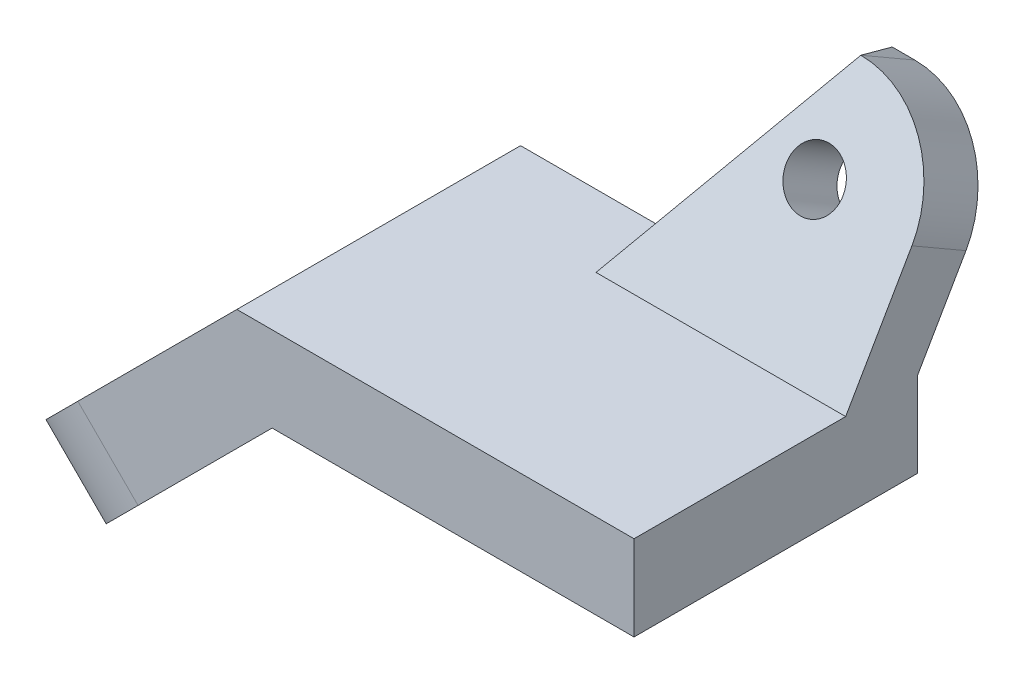
ISO-10303-21;
HEADER;
FILE_DESCRIPTION(('STEP AP214'),'2;1');
FILE_NAME('part.step','',(''),(''),'','','');
FILE_SCHEMA(('AUTOMOTIVE_DESIGN { 1 0 10303 214 1 1 1 1 }'));
ENDSEC;
DATA;
#1=APPLICATION_CONTEXT('core data for automotive mechanical design processes');
#2=APPLICATION_PROTOCOL_DEFINITION('international standard','automotive_design',2000,#1);
#3=PRODUCT_CONTEXT('',#1,'mechanical');
#4=PRODUCT('Part','Part','',(#3));
#5=PRODUCT_RELATED_PRODUCT_CATEGORY('part','',(#4));
#6=PRODUCT_DEFINITION_FORMATION('','',#4);
#7=PRODUCT_DEFINITION_CONTEXT('part definition',#1,'design');
#8=PRODUCT_DEFINITION('design','',#6,#7);
#9=PRODUCT_DEFINITION_SHAPE('','',#8);
#10=(LENGTH_UNIT() NAMED_UNIT(*) SI_UNIT(.MILLI.,.METRE.));
#11=(NAMED_UNIT(*) PLANE_ANGLE_UNIT() SI_UNIT($,.RADIAN.));
#12=(NAMED_UNIT(*) SI_UNIT($,.STERADIAN.) SOLID_ANGLE_UNIT());
#13=UNCERTAINTY_MEASURE_WITH_UNIT(LENGTH_MEASURE(1.E-05),#10,'distance_accuracy_value','');
#14=(GEOMETRIC_REPRESENTATION_CONTEXT(3) GLOBAL_UNCERTAINTY_ASSIGNED_CONTEXT((#13)) GLOBAL_UNIT_ASSIGNED_CONTEXT((#10,
#11,#12)) REPRESENTATION_CONTEXT('',''));
#15=CARTESIAN_POINT('',(0.,0.,0.));
#16=DIRECTION('',(0.,0.,1.));
#17=DIRECTION('',(1.,0.,0.));
#18=AXIS2_PLACEMENT_3D('',#15,#16,#17);
#19=CARTESIAN_POINT('',(0.,0.,25.));
#20=DIRECTION('',(0.707106781186544,-0.707106781186551,0.));
#21=DIRECTION('',(0.707106781186551,0.707106781186544,0.));
#22=AXIS2_PLACEMENT_3D('',#19,#20,#21);
#23=PLANE('',#22);
#24=CARTESIAN_POINT('',(-28.0195290848678,-28.0195290848675,0.));
#25=DIRECTION('',(-0.707106781186544,0.707106781186551,0.));
#26=DIRECTION('',(-0.707106781186551,-0.707106781186544,0.));
#27=AXIS2_PLACEMENT_3D('',#24,#25,#26);
#28=CIRCLE('',#27,15.);
#29=CARTESIAN_POINT('',(-38.626130802666,-38.6261308026656,0.));
#30=VERTEX_POINT('',#29);
#31=EDGE_CURVE('E168',#30,#30,#28,.T.);
#32=ORIENTED_EDGE('',*,*,#31,.F.);
#33=EDGE_LOOP('',(#32));
#34=FACE_BOUND('',#33,.T.);
#35=DIRECTION('',(-0.707106781186551,-0.707106781186544,0.));
#36=VECTOR('',#35,1.);
#37=CARTESIAN_POINT('',(0.,0.,-25.));
#38=LINE('',#37,#36);
#39=CARTESIAN_POINT('',(0.,0.,-25.));
#40=VERTEX_POINT('',#39);
#41=CARTESIAN_POINT('',(-28.0195290848678,-28.0195290848675,-25.));
#42=VERTEX_POINT('',#41);
#43=EDGE_CURVE('E183',#40,#42,#38,.T.);
#44=ORIENTED_EDGE('',*,*,#43,.T.);
#45=CARTESIAN_POINT('',(-28.0195290848678,-28.0195290848675,0.));
#46=DIRECTION('',(0.707106781186544,-0.707106781186551,0.));
#47=DIRECTION('',(-0.707106781186551,-0.707106781186544,0.));
#48=AXIS2_PLACEMENT_3D('',#45,#46,#47);
#49=CIRCLE('',#48,25.);
#50=CARTESIAN_POINT('',(-28.0195290848678,-28.0195290848675,25.));
#51=VERTEX_POINT('',#50);
#52=EDGE_CURVE('E178',#51,#42,#49,.T.);
#53=ORIENTED_EDGE('',*,*,#52,.F.);
#54=DIRECTION('',(-0.707106781186551,-0.707106781186544,0.));
#55=VECTOR('',#54,1.);
#56=CARTESIAN_POINT('',(0.,0.,25.));
#57=LINE('',#56,#55);
#58=CARTESIAN_POINT('',(0.,0.,25.));
#59=VERTEX_POINT('',#58);
#60=EDGE_CURVE('E184',#59,#51,#57,.T.);
#61=ORIENTED_EDGE('',*,*,#60,.F.);
#62=DIRECTION('',(0.,0.,-1.));
#63=VECTOR('',#62,1.);
#64=CARTESIAN_POINT('',(0.,0.,25.));
#65=LINE('',#64,#63);
#66=EDGE_CURVE('E199',#59,#40,#65,.T.);
#67=ORIENTED_EDGE('',*,*,#66,.T.);
#68=EDGE_LOOP('',(#44,#53,#61,#67));
#69=FACE_BOUND('',#68,.T.);
#70=ADVANCED_FACE('F33',(#34,#69),#23,.F.);
#71=CARTESIAN_POINT('',(10.6066017177982,-10.6066017177983,25.));
#72=DIRECTION('',(0.707106781186544,-0.707106781186551,0.));
#73=DIRECTION('',(0.707106781186551,0.707106781186544,0.));
#74=AXIS2_PLACEMENT_3D('',#71,#72,#73);
#75=PLANE('',#74);
#76=CARTESIAN_POINT('',(-17.4129273670696,-38.6261308026657,0.));
#77=DIRECTION('',(0.707106781186544,-0.707106781186551,0.));
#78=DIRECTION('',(0.707106781186551,0.707106781186544,0.));
#79=AXIS2_PLACEMENT_3D('',#76,#77,#78);
#80=CIRCLE('',#79,15.);
#81=CARTESIAN_POINT('',(-6.80632564927135,-28.0195290848676,0.));
#82=VERTEX_POINT('',#81);
#83=EDGE_CURVE('E117',#82,#82,#80,.F.);
#84=ORIENTED_EDGE('',*,*,#83,.T.);
#85=EDGE_LOOP('',(#84));
#86=FACE_BOUND('',#85,.T.);
#87=CARTESIAN_POINT('',(-17.4129273670696,-38.6261308026658,0.));
#88=DIRECTION('',(0.707106781186544,-0.707106781186551,0.));
#89=DIRECTION('',(0.707106781186551,0.707106781186544,0.));
#90=AXIS2_PLACEMENT_3D('',#87,#88,#89);
#91=CIRCLE('',#90,25.);
#92=CARTESIAN_POINT('',(-17.4129273670696,-38.6261308026657,25.));
#93=VERTEX_POINT('',#92);
#94=CARTESIAN_POINT('',(-17.4129273670696,-38.6261308026657,-25.));
#95=VERTEX_POINT('',#94);
#96=EDGE_CURVE('E180',#93,#95,#91,.T.);
#97=ORIENTED_EDGE('',*,*,#96,.T.);
#98=DIRECTION('',(-0.707106781186551,-0.707106781186544,0.));
#99=VECTOR('',#98,1.);
#100=CARTESIAN_POINT('',(10.6066017177982,-10.6066017177983,-25.));
#101=LINE('',#100,#99);
#102=CARTESIAN_POINT('',(6.21320343559638,-15.,-25.));
#103=VERTEX_POINT('',#102);
#104=EDGE_CURVE('E202',#103,#95,#101,.T.);
#105=ORIENTED_EDGE('',*,*,#104,.F.);
#106=DIRECTION('',(0.,0.,-1.));
#107=VECTOR('',#106,1.);
#108=CARTESIAN_POINT('',(6.21320343559638,-15.,25.));
#109=LINE('',#108,#107);
#110=CARTESIAN_POINT('',(6.21320343559638,-15.,25.));
#111=VERTEX_POINT('',#110);
#112=EDGE_CURVE('E133',#111,#103,#109,.T.);
#113=ORIENTED_EDGE('',*,*,#112,.F.);
#114=DIRECTION('',(-0.707106781186551,-0.707106781186544,0.));
#115=VECTOR('',#114,1.);
#116=CARTESIAN_POINT('',(10.6066017177982,-10.6066017177983,25.));
#117=LINE('',#116,#115);
#118=EDGE_CURVE('E187',#111,#93,#117,.T.);
#119=ORIENTED_EDGE('',*,*,#118,.T.);
#120=EDGE_LOOP('',(#97,#105,#113,#119));
#121=FACE_BOUND('',#120,.T.);
#122=ADVANCED_FACE('F231',(#86,#121),#75,.T.);
#123=CARTESIAN_POINT('',(0.,-15.,25.));
#124=DIRECTION('',(0.,-1.,0.));
#125=DIRECTION('',(0.,0.,-1.));
#126=AXIS2_PLACEMENT_3D('',#123,#124,#125);
#127=PLANE('',#126);
#128=DIRECTION('',(1.,0.,0.));
#129=VECTOR('',#128,1.);
#130=CARTESIAN_POINT('',(0.,-15.,-25.));
#131=LINE('',#130,#129);
#132=CARTESIAN_POINT('',(70.,-15.,-25.));
#133=VERTEX_POINT('',#132);
#134=EDGE_CURVE('E205',#133,#103,#131,.F.);
#135=ORIENTED_EDGE('',*,*,#134,.F.);
#136=DIRECTION('',(0.,0.,-1.));
#137=VECTOR('',#136,1.);
#138=CARTESIAN_POINT('',(70.,-15.,25.));
#139=LINE('',#138,#137);
#140=CARTESIAN_POINT('',(70.,-15.,25.));
#141=VERTEX_POINT('',#140);
#142=EDGE_CURVE('E138',#141,#133,#139,.T.);
#143=ORIENTED_EDGE('',*,*,#142,.F.);
#144=DIRECTION('',(1.,0.,0.));
#145=VECTOR('',#144,1.);
#146=CARTESIAN_POINT('',(0.,-15.,25.));
#147=LINE('',#146,#145);
#148=EDGE_CURVE('E191',#141,#111,#147,.F.);
#149=ORIENTED_EDGE('',*,*,#148,.T.);
#150=ORIENTED_EDGE('',*,*,#112,.T.);
#151=EDGE_LOOP('',(#135,#143,#149,#150));
#152=FACE_BOUND('',#151,.T.);
#153=ADVANCED_FACE('F217',(#152),#127,.T.);
#154=CARTESIAN_POINT('',(70.,0.,25.));
#155=DIRECTION('',(1.,0.,0.));
#156=DIRECTION('',(0.,0.,-1.));
#157=AXIS2_PLACEMENT_3D('',#154,#155,#156);
#158=PLANE('',#157);
#159=DIRECTION('',(0.,-0.86602540378444,0.499999999999998));
#160=VECTOR('',#159,1.);
#161=CARTESIAN_POINT('',(70.,0.,-25.));
#162=LINE('',#161,#160);
#163=CARTESIAN_POINT('',(70.,14.7224318643355,-33.5));
#164=VERTEX_POINT('',#163);
#165=CARTESIAN_POINT('',(70.,0.,-25.));
#166=VERTEX_POINT('',#165);
#167=EDGE_CURVE('E145',#164,#166,#162,.T.);
#168=ORIENTED_EDGE('',*,*,#167,.F.);
#169=DIRECTION('',(0.,-0.499999999999998,-0.86602540378444));
#170=VECTOR('',#169,1.);
#171=CARTESIAN_POINT('',(70.,20.2224318643355,-23.9737205583711));
#172=LINE('',#171,#170);
#173=CARTESIAN_POINT('',(70.,20.2224318643355,-23.9737205583711));
#174=VERTEX_POINT('',#173);
#175=EDGE_CURVE('E41',#164,#174,#172,.F.);
#176=ORIENTED_EDGE('',*,*,#175,.T.);
#177=DIRECTION('',(0.,-0.86602540378444,0.499999999999998));
#178=VECTOR('',#177,1.);
#179=CARTESIAN_POINT('',(70.,5.49999999999997,-15.4737205583712));
#180=LINE('',#179,#178);
#181=CARTESIAN_POINT('',(70.,0.,-12.2982940778283));
#182=VERTEX_POINT('',#181);
#183=EDGE_CURVE('E153',#174,#182,#180,.T.);
#184=ORIENTED_EDGE('',*,*,#183,.T.);
#185=DIRECTION('',(0.,0.,-1.));
#186=VECTOR('',#185,1.);
#187=CARTESIAN_POINT('',(70.,0.,25.));
#188=LINE('',#187,#186);
#189=CARTESIAN_POINT('',(70.,0.,25.));
#190=VERTEX_POINT('',#189);
#191=EDGE_CURVE('E131',#190,#182,#188,.T.);
#192=ORIENTED_EDGE('',*,*,#191,.F.);
#193=DIRECTION('',(0.,-1.,0.));
#194=VECTOR('',#193,1.);
#195=CARTESIAN_POINT('',(70.,0.,25.));
#196=LINE('',#195,#194);
#197=EDGE_CURVE('E194',#190,#141,#196,.T.);
#198=ORIENTED_EDGE('',*,*,#197,.T.);
#199=ORIENTED_EDGE('',*,*,#142,.T.);
#200=DIRECTION('',(0.,-1.,0.));
#201=VECTOR('',#200,1.);
#202=CARTESIAN_POINT('',(70.,0.,-25.));
#203=LINE('',#202,#201);
#204=EDGE_CURVE('E152',#166,#133,#203,.T.);
#205=ORIENTED_EDGE('',*,*,#204,.F.);
#206=EDGE_LOOP('',(#168,#176,#184,#192,#198,#199,#205));
#207=FACE_BOUND('',#206,.T.);
#208=ADVANCED_FACE('F150',(#207),#158,.T.);
#209=CARTESIAN_POINT('',(0.,0.,25.));
#210=DIRECTION('',(0.,-1.,0.));
#211=DIRECTION('',(0.,0.,-1.));
#212=AXIS2_PLACEMENT_3D('',#209,#210,#211);
#213=PLANE('',#212);
#214=ORIENTED_EDGE('',*,*,#191,.T.);
#215=DIRECTION('',(-1.,0.,0.));
#216=VECTOR('',#215,1.);
#217=CARTESIAN_POINT('',(0.,0.,-12.2982940778283));
#218=LINE('',#217,#216);
#219=CARTESIAN_POINT('',(26.,0.,-12.2982940778283));
#220=VERTEX_POINT('',#219);
#221=EDGE_CURVE('E124',#182,#220,#218,.T.);
#222=ORIENTED_EDGE('',*,*,#221,.T.);
#223=DIRECTION('',(0.,0.,-1.));
#224=VECTOR('',#223,1.);
#225=CARTESIAN_POINT('',(26.,0.,25.));
#226=LINE('',#225,#224);
#227=CARTESIAN_POINT('',(26.,0.,-25.));
#228=VERTEX_POINT('',#227);
#229=EDGE_CURVE('E108',#220,#228,#226,.T.);
#230=ORIENTED_EDGE('',*,*,#229,.T.);
#231=DIRECTION('',(-1.,0.,0.));
#232=VECTOR('',#231,1.);
#233=CARTESIAN_POINT('',(0.,0.,-25.));
#234=LINE('',#233,#232);
#235=EDGE_CURVE('E209',#228,#40,#234,.T.);
#236=ORIENTED_EDGE('',*,*,#235,.T.);
#237=ORIENTED_EDGE('',*,*,#66,.F.);
#238=DIRECTION('',(-1.,0.,0.));
#239=VECTOR('',#238,1.);
#240=CARTESIAN_POINT('',(0.,0.,25.));
#241=LINE('',#240,#239);
#242=EDGE_CURVE('E197',#190,#59,#241,.T.);
#243=ORIENTED_EDGE('',*,*,#242,.F.);
#244=EDGE_LOOP('',(#214,#222,#230,#236,#237,#243));
#245=FACE_BOUND('',#244,.T.);
#246=ADVANCED_FACE('F129',(#245),#213,.F.);
#247=CARTESIAN_POINT('',(0.,0.,25.));
#248=DIRECTION('',(0.,0.,-1.));
#249=DIRECTION('',(-1.,0.,0.));
#250=AXIS2_PLACEMENT_3D('',#247,#248,#249);
#251=PLANE('',#250);
#252=ORIENTED_EDGE('',*,*,#60,.T.);
#253=DIRECTION('',(-0.707106781186544,0.707106781186551,0.));
#254=VECTOR('',#253,1.);
#255=CARTESIAN_POINT('',(35.2657421625937,-91.3048003323296,25.));
#256=LINE('',#255,#254);
#257=EDGE_CURVE('E176',#93,#51,#256,.T.);
#258=ORIENTED_EDGE('',*,*,#257,.F.);
#259=ORIENTED_EDGE('',*,*,#118,.F.);
#260=ORIENTED_EDGE('',*,*,#148,.F.);
#261=ORIENTED_EDGE('',*,*,#197,.F.);
#262=ORIENTED_EDGE('',*,*,#242,.T.);
#263=EDGE_LOOP('',(#252,#258,#259,#260,#261,#262));
#264=FACE_BOUND('',#263,.T.);
#265=ADVANCED_FACE('F228',(#264),#251,.F.);
#266=CARTESIAN_POINT('',(0.,0.,-25.));
#267=DIRECTION('',(0.,0.,-1.));
#268=DIRECTION('',(-1.,0.,0.));
#269=AXIS2_PLACEMENT_3D('',#266,#267,#268);
#270=PLANE('',#269);
#271=DIRECTION('',(-0.707106781186544,0.707106781186551,0.));
#272=VECTOR('',#271,1.);
#273=CARTESIAN_POINT('',(35.2657421625937,-91.3048003323296,-25.));
#274=LINE('',#273,#272);
#275=EDGE_CURVE('E171',#95,#42,#274,.T.);
#276=ORIENTED_EDGE('',*,*,#275,.T.);
#277=ORIENTED_EDGE('',*,*,#43,.F.);
#278=ORIENTED_EDGE('',*,*,#235,.F.);
#279=EDGE_CURVE('E188',#166,#228,#234,.T.);
#280=ORIENTED_EDGE('',*,*,#279,.F.);
#281=ORIENTED_EDGE('',*,*,#204,.T.);
#282=ORIENTED_EDGE('',*,*,#134,.T.);
#283=ORIENTED_EDGE('',*,*,#104,.T.);
#284=EDGE_LOOP('',(#276,#277,#278,#280,#281,#282,#283));
#285=FACE_BOUND('',#284,.T.);
#286=ADVANCED_FACE('F220',(#285),#270,.T.);
#287=CARTESIAN_POINT('',(35.2657421625937,-91.3048003323296,0.));
#288=DIRECTION('',(-0.707106781186544,0.707106781186551,0.));
#289=DIRECTION('',(-0.707106781186551,-0.707106781186544,0.));
#290=AXIS2_PLACEMENT_3D('',#287,#288,#289);
#291=CYLINDRICAL_SURFACE('',#290,25.);
#292=ORIENTED_EDGE('',*,*,#257,.T.);
#293=ORIENTED_EDGE('',*,*,#52,.T.);
#294=ORIENTED_EDGE('',*,*,#275,.F.);
#295=ORIENTED_EDGE('',*,*,#96,.F.);
#296=EDGE_LOOP('',(#292,#293,#294,#295));
#297=FACE_BOUND('',#296,.T.);
#298=ADVANCED_FACE('F233',(#297),#291,.T.);
#299=CARTESIAN_POINT('',(35.1333710812966,-91.1724292510324,0.));
#300=DIRECTION('',(-0.707106781186544,0.707106781186551,0.));
#301=DIRECTION('',(-0.707106781186551,-0.707106781186544,0.));
#302=AXIS2_PLACEMENT_3D('',#299,#300,#301);
#303=CYLINDRICAL_SURFACE('',#302,15.);
#304=ORIENTED_EDGE('',*,*,#83,.F.);
#305=EDGE_LOOP('',(#304));
#306=FACE_BOUND('',#305,.T.);
#307=ORIENTED_EDGE('',*,*,#31,.T.);
#308=EDGE_LOOP('',(#307));
#309=FACE_BOUND('',#308,.T.);
#310=ADVANCED_FACE('F235',(#306,#309),#303,.F.);
#311=CARTESIAN_POINT('',(26.,5.49999999999997,-15.4737205583712));
#312=DIRECTION('',(0.,0.499999999999998,0.86602540378444));
#313=DIRECTION('',(0.,-0.86602540378444,0.499999999999998));
#314=AXIS2_PLACEMENT_3D('',#311,#312,#313);
#315=PLANE('',#314);
#316=DIRECTION('',(0.532289455216339,0.733144564120284,-0.423281211449754));
#317=VECTOR('',#316,1.);
#318=CARTESIAN_POINT('',(26.,0.,-12.2982940778283));
#319=LINE('',#318,#317);
#320=CARTESIAN_POINT('',(52.,35.8108891324554,-32.9737205583711));
#321=VERTEX_POINT('',#320);
#322=EDGE_CURVE('E111',#220,#321,#319,.T.);
#323=ORIENTED_EDGE('',*,*,#322,.F.);
#324=ORIENTED_EDGE('',*,*,#221,.F.);
#325=ORIENTED_EDGE('',*,*,#183,.F.);
#326=CARTESIAN_POINT('',(52.,20.2224318643355,-23.9737205583711));
#327=DIRECTION('',(0.,0.499999999999998,0.86602540378444));
#328=DIRECTION('',(0.,-0.86602540378444,0.499999999999998));
#329=AXIS2_PLACEMENT_3D('',#326,#327,#328);
#330=CIRCLE('',#329,18.);
#331=EDGE_CURVE('E11',#174,#321,#330,.T.);
#332=ORIENTED_EDGE('',*,*,#331,.T.);
#333=EDGE_LOOP('',(#323,#324,#325,#332));
#334=FACE_BOUND('',#333,.T.);
#335=CARTESIAN_POINT('',(52.2892080753698,21.2097584951607,-24.5437538544561));
#336=DIRECTION('',(0.,0.499999999999998,0.86602540378444));
#337=DIRECTION('',(0.,-0.86602540378444,0.499999999999998));
#338=AXIS2_PLACEMENT_3D('',#335,#336,#337);
#339=CIRCLE('',#338,5.);
#340=CARTESIAN_POINT('',(52.2892080753698,16.8796314762385,-22.0437538544562));
#341=VERTEX_POINT('',#340);
#342=EDGE_CURVE('E158',#341,#341,#339,.T.);
#343=ORIENTED_EDGE('',*,*,#342,.F.);
#344=EDGE_LOOP('',(#343));
#345=FACE_BOUND('',#344,.T.);
#346=ADVANCED_FACE('F122',(#334,#345),#315,.T.);
#347=CARTESIAN_POINT('',(26.,35.8108891324554,-32.9737205583711));
#348=DIRECTION('',(0.,-0.86602540378444,0.499999999999998));
#349=DIRECTION('',(0.,-0.499999999999998,-0.86602540378444));
#350=AXIS2_PLACEMENT_3D('',#347,#348,#349);
#351=PLANE('',#350);
#352=DIRECTION('',(1.,0.,0.));
#353=VECTOR('',#352,1.);
#354=CARTESIAN_POINT('',(26.,30.3108891324554,-42.4999999999999));
#355=LINE('',#354,#353);
#356=CARTESIAN_POINT('',(48.0068011863353,30.3108891324554,-42.4999999999999));
#357=VERTEX_POINT('',#356);
#358=CARTESIAN_POINT('',(52.,30.3108891324554,-42.4999999999999));
#359=VERTEX_POINT('',#358);
#360=EDGE_CURVE('E118',#357,#359,#355,.T.);
#361=ORIENTED_EDGE('',*,*,#360,.F.);
#362=DIRECTION('',(0.341229707251092,0.469989969810348,0.81404650675929));
#363=VECTOR('',#362,1.);
#364=CARTESIAN_POINT('',(48.9726194591227,31.6411510974127,-40.1959186893175));
#365=LINE('',#364,#363);
#366=EDGE_CURVE('E48',#357,#321,#365,.T.);
#367=ORIENTED_EDGE('',*,*,#366,.T.);
#368=DIRECTION('',(0.,-0.499999999999998,-0.86602540378444));
#369=VECTOR('',#368,1.);
#370=CARTESIAN_POINT('',(52.,30.3108891324554,-42.4999999999999));
#371=LINE('',#370,#369);
#372=EDGE_CURVE('E132',#321,#359,#371,.T.);
#373=ORIENTED_EDGE('',*,*,#372,.T.);
#374=EDGE_LOOP('',(#361,#367,#373));
#375=FACE_BOUND('',#374,.T.);
#376=ADVANCED_FACE('F157',(#375),#351,.F.);
#377=CARTESIAN_POINT('',(26.,0.,-25.));
#378=DIRECTION('',(0.,0.499999999999998,0.86602540378444));
#379=DIRECTION('',(0.,-0.86602540378444,0.499999999999998));
#380=AXIS2_PLACEMENT_3D('',#377,#378,#379);
#381=PLANE('',#380);
#382=CARTESIAN_POINT('',(52.2892080753698,15.7097584951607,-34.070033296085));
#383=DIRECTION('',(0.,0.499999999999998,0.86602540378444));
#384=DIRECTION('',(0.,-0.86602540378444,0.499999999999998));
#385=AXIS2_PLACEMENT_3D('',#382,#383,#384);
#386=CIRCLE('',#385,5.);
#387=CARTESIAN_POINT('',(52.2892080753698,11.3796314762385,-31.570033296085));
#388=VERTEX_POINT('',#387);
#389=EDGE_CURVE('E154',#388,#388,#386,.F.);
#390=ORIENTED_EDGE('',*,*,#389,.F.);
#391=EDGE_LOOP('',(#390));
#392=FACE_BOUND('',#391,.T.);
#393=ORIENTED_EDGE('',*,*,#279,.T.);
#394=DIRECTION('',(-0.532289455216339,-0.733144564120284,0.423281211449755));
#395=VECTOR('',#394,1.);
#396=CARTESIAN_POINT('',(37.8565753045559,16.3305578354638,-34.4284519623217));
#397=LINE('',#396,#395);
#398=EDGE_CURVE('E112',#357,#228,#397,.T.);
#399=ORIENTED_EDGE('',*,*,#398,.F.);
#400=ORIENTED_EDGE('',*,*,#360,.T.);
#401=CARTESIAN_POINT('',(52.,14.7224318643355,-33.5));
#402=DIRECTION('',(0.,0.499999999999998,0.86602540378444));
#403=DIRECTION('',(0.,-0.86602540378444,0.499999999999998));
#404=AXIS2_PLACEMENT_3D('',#401,#402,#403);
#405=CIRCLE('',#404,18.);
#406=EDGE_CURVE('E136',#359,#164,#405,.F.);
#407=ORIENTED_EDGE('',*,*,#406,.T.);
#408=ORIENTED_EDGE('',*,*,#167,.T.);
#409=EDGE_LOOP('',(#393,#399,#400,#407,#408));
#410=FACE_BOUND('',#409,.T.);
#411=ADVANCED_FACE('F144',(#392,#410),#381,.F.);
#412=CARTESIAN_POINT('',(52.,20.2224318643355,-23.9737205583711));
#413=DIRECTION('',(0.,0.499999999999998,0.86602540378444));
#414=DIRECTION('',(0.,-0.86602540378444,0.499999999999998));
#415=AXIS2_PLACEMENT_3D('',#412,#413,#414);
#416=CYLINDRICAL_SURFACE('',#415,18.);
#417=ORIENTED_EDGE('',*,*,#331,.F.);
#418=ORIENTED_EDGE('',*,*,#175,.F.);
#419=ORIENTED_EDGE('',*,*,#406,.F.);
#420=ORIENTED_EDGE('',*,*,#372,.F.);
#421=EDGE_LOOP('',(#417,#418,#419,#420));
#422=FACE_BOUND('',#421,.T.);
#423=ADVANCED_FACE('F35',(#422),#416,.T.);
#424=CARTESIAN_POINT('',(52.2892080753698,-5.9445968837372,-71.5764770174888));
#425=DIRECTION('',(0.,0.499999999999998,0.86602540378444));
#426=DIRECTION('',(0.,-0.86602540378444,0.499999999999998));
#427=AXIS2_PLACEMENT_3D('',#424,#425,#426);
#428=CYLINDRICAL_SURFACE('',#427,5.);
#429=ORIENTED_EDGE('',*,*,#342,.T.);
#430=EDGE_LOOP('',(#429));
#431=FACE_BOUND('',#430,.T.);
#432=ORIENTED_EDGE('',*,*,#389,.T.);
#433=EDGE_LOOP('',(#432));
#434=FACE_BOUND('',#433,.T.);
#435=ADVANCED_FACE('F309',(#431,#434),#428,.F.);
#436=CARTESIAN_POINT('',(26.,0.,-77.6238247337544));
#437=DIRECTION('',(0.809211806529543,-0.587517022879502,0.));
#438=DIRECTION('',(0.587517022879502,0.809211806529543,0.));
#439=AXIS2_PLACEMENT_3D('',#436,#437,#438);
#440=PLANE('',#439);
#441=ORIENTED_EDGE('',*,*,#398,.T.);
#442=ORIENTED_EDGE('',*,*,#229,.F.);
#443=ORIENTED_EDGE('',*,*,#322,.T.);
#444=ORIENTED_EDGE('',*,*,#366,.F.);
#445=EDGE_LOOP('',(#441,#442,#443,#444));
#446=FACE_BOUND('',#445,.T.);
#447=ADVANCED_FACE('F110',(#446),#440,.F.);
#448=CLOSED_SHELL('',(#70,#122,#153,#208,#246,#265,#286,#298,#310,#346,#376,#411,#423,#435,#447));
#449=MANIFOLD_SOLID_BREP('B2',#448);
#450=ADVANCED_BREP_SHAPE_REPRESENTATION('',(#18,#449),#14);
#451=SHAPE_DEFINITION_REPRESENTATION(#9,#450);
ENDSEC;
END-ISO-10303-21;
